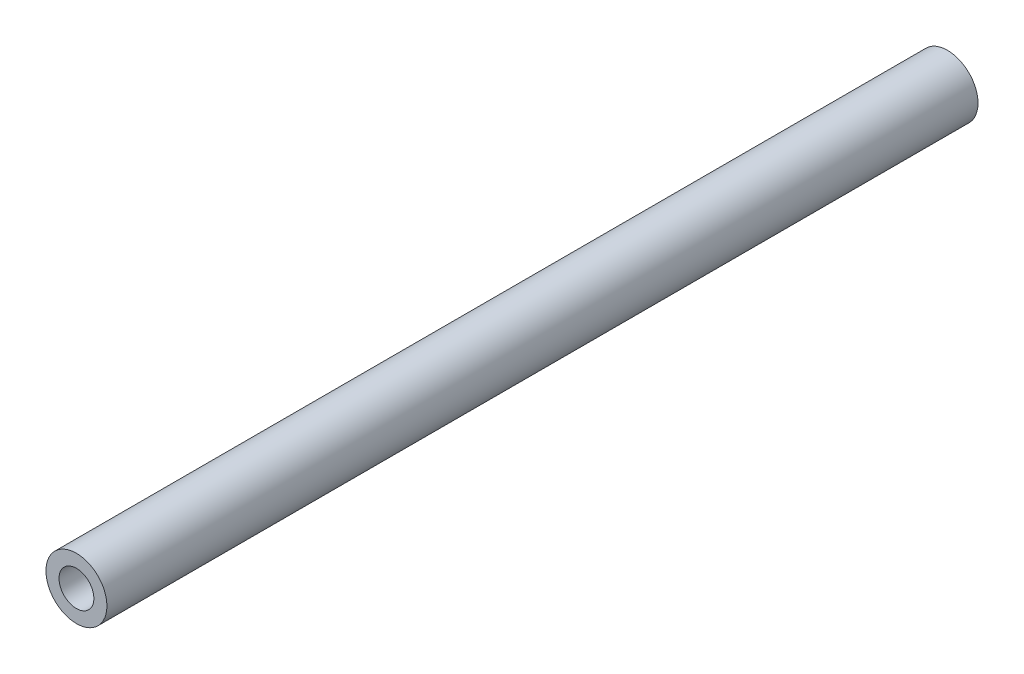
ISO-10303-21;
HEADER;
FILE_DESCRIPTION(('STEP AP214'),'2;1');
FILE_NAME('part.step','',(''),(''),'','','');
FILE_SCHEMA(('AUTOMOTIVE_DESIGN { 1 0 10303 214 1 1 1 1 }'));
ENDSEC;
DATA;
#1=APPLICATION_CONTEXT('core data for automotive mechanical design processes');
#2=APPLICATION_PROTOCOL_DEFINITION('international standard','automotive_design',2000,#1);
#3=PRODUCT_CONTEXT('',#1,'mechanical');
#4=PRODUCT('Part','Part','',(#3));
#5=PRODUCT_RELATED_PRODUCT_CATEGORY('part','',(#4));
#6=PRODUCT_DEFINITION_FORMATION('','',#4);
#7=PRODUCT_DEFINITION_CONTEXT('part definition',#1,'design');
#8=PRODUCT_DEFINITION('design','',#6,#7);
#9=PRODUCT_DEFINITION_SHAPE('','',#8);
#10=(LENGTH_UNIT() NAMED_UNIT(*) SI_UNIT(.MILLI.,.METRE.));
#11=(NAMED_UNIT(*) PLANE_ANGLE_UNIT() SI_UNIT($,.RADIAN.));
#12=(NAMED_UNIT(*) SI_UNIT($,.STERADIAN.) SOLID_ANGLE_UNIT());
#13=UNCERTAINTY_MEASURE_WITH_UNIT(LENGTH_MEASURE(1.E-05),#10,'distance_accuracy_value','');
#14=(GEOMETRIC_REPRESENTATION_CONTEXT(3) GLOBAL_UNCERTAINTY_ASSIGNED_CONTEXT((#13)) GLOBAL_UNIT_ASSIGNED_CONTEXT((#10,
#11,#12)) REPRESENTATION_CONTEXT('',''));
#15=CARTESIAN_POINT('',(0.,0.,0.));
#16=DIRECTION('',(0.,0.,1.));
#17=DIRECTION('',(1.,0.,0.));
#18=AXIS2_PLACEMENT_3D('',#15,#16,#17);
#19=CARTESIAN_POINT('',(0.,0.,50.));
#20=DIRECTION('',(0.,0.,1.));
#21=DIRECTION('',(1.,0.,0.));
#22=AXIS2_PLACEMENT_3D('',#19,#20,#21);
#23=PLANE('',#22);
#24=CARTESIAN_POINT('',(0.,0.,50.));
#25=DIRECTION('',(0.,0.,1.));
#26=DIRECTION('',(1.,0.,0.));
#27=AXIS2_PLACEMENT_3D('',#24,#25,#26);
#28=CIRCLE('',#27,1.75);
#29=CARTESIAN_POINT('',(1.75,0.,50.));
#30=VERTEX_POINT('',#29);
#31=EDGE_CURVE('E10',#30,#30,#28,.T.);
#32=ORIENTED_EDGE('',*,*,#31,.T.);
#33=EDGE_LOOP('',(#32));
#34=FACE_BOUND('',#33,.T.);
#35=CARTESIAN_POINT('',(0.,0.,50.));
#36=DIRECTION('',(0.,0.,1.));
#37=DIRECTION('',(1.,0.,0.));
#38=AXIS2_PLACEMENT_3D('',#35,#36,#37);
#39=CIRCLE('',#38,1.);
#40=CARTESIAN_POINT('',(1.,0.,50.));
#41=VERTEX_POINT('',#40);
#42=EDGE_CURVE('E44',#41,#41,#39,.T.);
#43=ORIENTED_EDGE('',*,*,#42,.F.);
#44=EDGE_LOOP('',(#43));
#45=FACE_BOUND('',#44,.T.);
#46=ADVANCED_FACE('F33',(#34,#45),#23,.T.);
#47=CARTESIAN_POINT('',(0.,0.,0.));
#48=DIRECTION('',(0.,0.,1.));
#49=DIRECTION('',(1.,0.,0.));
#50=AXIS2_PLACEMENT_3D('',#47,#48,#49);
#51=PLANE('',#50);
#52=CARTESIAN_POINT('',(0.,0.,0.));
#53=DIRECTION('',(0.,0.,1.));
#54=DIRECTION('',(1.,0.,0.));
#55=AXIS2_PLACEMENT_3D('',#52,#53,#54);
#56=CIRCLE('',#55,1.75);
#57=CARTESIAN_POINT('',(1.75,0.,0.));
#58=VERTEX_POINT('',#57);
#59=EDGE_CURVE('E37',#58,#58,#56,.T.);
#60=ORIENTED_EDGE('',*,*,#59,.F.);
#61=EDGE_LOOP('',(#60));
#62=FACE_BOUND('',#61,.T.);
#63=CARTESIAN_POINT('',(0.,0.,0.));
#64=DIRECTION('',(0.,0.,1.));
#65=DIRECTION('',(1.,0.,0.));
#66=AXIS2_PLACEMENT_3D('',#63,#64,#65);
#67=CIRCLE('',#66,1.);
#68=CARTESIAN_POINT('',(1.,0.,0.));
#69=VERTEX_POINT('',#68);
#70=EDGE_CURVE('E46',#69,#69,#67,.T.);
#71=ORIENTED_EDGE('',*,*,#70,.T.);
#72=EDGE_LOOP('',(#71));
#73=FACE_BOUND('',#72,.T.);
#74=ADVANCED_FACE('F56',(#62,#73),#51,.F.);
#75=CARTESIAN_POINT('',(0.,0.,50.));
#76=DIRECTION('',(0.,0.,-1.));
#77=DIRECTION('',(-1.,0.,0.));
#78=AXIS2_PLACEMENT_3D('',#75,#76,#77);
#79=CYLINDRICAL_SURFACE('',#78,1.75);
#80=ORIENTED_EDGE('',*,*,#31,.F.);
#81=EDGE_LOOP('',(#80));
#82=FACE_BOUND('',#81,.T.);
#83=ORIENTED_EDGE('',*,*,#59,.T.);
#84=EDGE_LOOP('',(#83));
#85=FACE_BOUND('',#84,.T.);
#86=ADVANCED_FACE('F35',(#82,#85),#79,.T.);
#87=CARTESIAN_POINT('',(0.,0.,50.));
#88=DIRECTION('',(0.,0.,-1.));
#89=DIRECTION('',(-1.,0.,0.));
#90=AXIS2_PLACEMENT_3D('',#87,#88,#89);
#91=CYLINDRICAL_SURFACE('',#90,1.);
#92=ORIENTED_EDGE('',*,*,#42,.T.);
#93=EDGE_LOOP('',(#92));
#94=FACE_BOUND('',#93,.T.);
#95=ORIENTED_EDGE('',*,*,#70,.F.);
#96=EDGE_LOOP('',(#95));
#97=FACE_BOUND('',#96,.T.);
#98=ADVANCED_FACE('F52',(#94,#97),#91,.F.);
#99=CLOSED_SHELL('',(#46,#74,#86,#98));
#100=MANIFOLD_SOLID_BREP('B2',#99);
#101=ADVANCED_BREP_SHAPE_REPRESENTATION('',(#18,#100),#14);
#102=SHAPE_DEFINITION_REPRESENTATION(#9,#101);
ENDSEC;
END-ISO-10303-21;
